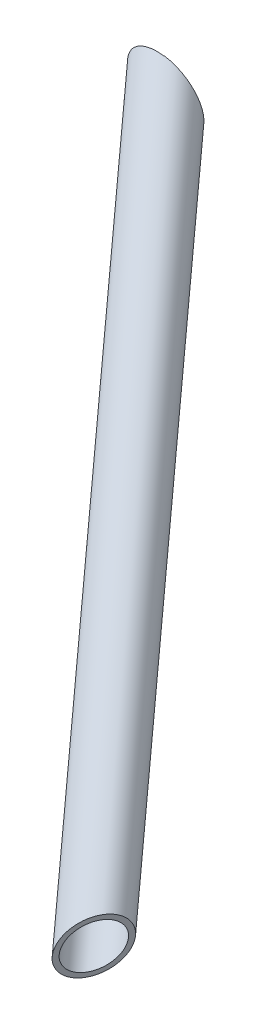
ISO-10303-21;
HEADER;
FILE_DESCRIPTION(('STEP AP214'),'2;1');
FILE_NAME('part.step','',(''),(''),'','','');
FILE_SCHEMA(('AUTOMOTIVE_DESIGN { 1 0 10303 214 1 1 1 1 }'));
ENDSEC;
DATA;
#1=APPLICATION_CONTEXT('core data for automotive mechanical design processes');
#2=APPLICATION_PROTOCOL_DEFINITION('international standard','automotive_design',2000,#1);
#3=PRODUCT_CONTEXT('',#1,'mechanical');
#4=PRODUCT('Part','Part','',(#3));
#5=PRODUCT_RELATED_PRODUCT_CATEGORY('part','',(#4));
#6=PRODUCT_DEFINITION_FORMATION('','',#4);
#7=PRODUCT_DEFINITION_CONTEXT('part definition',#1,'design');
#8=PRODUCT_DEFINITION('design','',#6,#7);
#9=PRODUCT_DEFINITION_SHAPE('','',#8);
#10=(LENGTH_UNIT() NAMED_UNIT(*) SI_UNIT(.MILLI.,.METRE.));
#11=(NAMED_UNIT(*) PLANE_ANGLE_UNIT() SI_UNIT($,.RADIAN.));
#12=(NAMED_UNIT(*) SI_UNIT($,.STERADIAN.) SOLID_ANGLE_UNIT());
#13=UNCERTAINTY_MEASURE_WITH_UNIT(LENGTH_MEASURE(1.E-05),#10,'distance_accuracy_value','');
#14=(GEOMETRIC_REPRESENTATION_CONTEXT(3) GLOBAL_UNCERTAINTY_ASSIGNED_CONTEXT((#13)) GLOBAL_UNIT_ASSIGNED_CONTEXT((#10,
#11,#12)) REPRESENTATION_CONTEXT('',''));
#15=CARTESIAN_POINT('',(0.,0.,0.));
#16=DIRECTION('',(0.,0.,1.));
#17=DIRECTION('',(1.,0.,0.));
#18=AXIS2_PLACEMENT_3D('',#15,#16,#17);
#19=CARTESIAN_POINT('',(-225.,200.,-200.));
#20=DIRECTION('',(0.636784790371592,-0.254713916148637,0.727754046138963));
#21=DIRECTION('',(0.752576694706878,0.,-0.658504607868518));
#22=AXIS2_PLACEMENT_3D('',#19,#20,#21);
#23=CYLINDRICAL_SURFACE('',#22,7.9);
#24=CARTESIAN_POINT('',(-212.607403081643,195.042961232657,-185.837032093306));
#25=DIRECTION('',(-0.936285084522112,-0.351106906695792,-0.00970466753338269));
#26=DIRECTION('',(0.181471265379071,-0.507210243684345,0.842499821093979));
#27=AXIS2_PLACEMENT_3D('',#24,#25,#26);
#28=ELLIPSE('',#27,15.3743489378713,7.9);
#29=CARTESIAN_POINT('',(-216.16230767722,204.63510274096,-189.903424238614));
#30=VERTEX_POINT('',#29);
#31=CARTESIAN_POINT('',(-216.168817710753,204.655132204404,-190.));
#32=VERTEX_POINT('',#31);
#33=EDGE_CURVE('E138',#30,#32,#28,.T.);
#34=ORIENTED_EDGE('',*,*,#33,.T.);
#35=CARTESIAN_POINT('',(-216.25,196.5,-190.));
#36=DIRECTION('',(0.,0.,-1.));
#37=DIRECTION('',(0.928476690885259,-0.371390676354104,0.));
#38=AXIS2_PLACEMENT_3D('',#35,#36,#37);
#39=ELLIPSE('',#38,10.8553158060924,7.9);
#40=CARTESIAN_POINT('',(-208.021674420814,190.,-190.));
#41=VERTEX_POINT('',#40);
#42=EDGE_CURVE('E135',#32,#41,#39,.T.);
#43=ORIENTED_EDGE('',*,*,#42,.T.);
#44=CARTESIAN_POINT('',(-200.,190.,-171.428571428571));
#45=DIRECTION('',(0.,1.,0.));
#46=DIRECTION('',(0.658504607868518,0.,0.752576694706878));
#47=AXIS2_PLACEMENT_3D('',#44,#45,#46);
#48=ELLIPSE('',#47,31.0151880174069,7.9);
#49=CARTESIAN_POINT('',(-210.653505513102,190.,-191.894594696183));
#50=VERTEX_POINT('',#49);
#51=EDGE_CURVE('E131',#41,#50,#48,.T.);
#52=ORIENTED_EDGE('',*,*,#51,.T.);
#53=CARTESIAN_POINT('',(-210.191356839065,188.712567172548,-189.903424238614));
#54=VERTEX_POINT('',#53);
#55=EDGE_CURVE('E134',#50,#54,#28,.T.);
#56=ORIENTED_EDGE('',*,*,#55,.T.);
#57=CARTESIAN_POINT('',(-216.19004498187,196.476017992748,-189.93147997928));
#58=DIRECTION('',(0.00908676337012188,0.0034075362637957,-0.999952908605234));
#59=DIRECTION('',(0.930970716300707,-0.365022539584079,0.0072160228753837));
#60=AXIS2_PLACEMENT_3D('',#57,#58,#59);
#61=ELLIPSE('',#60,10.9296964524874,7.9);
#62=CARTESIAN_POINT('',(-221.406204072577,190.278346413284,-190.));
#63=VERTEX_POINT('',#62);
#64=EDGE_CURVE('E130',#54,#63,#61,.T.);
#65=ORIENTED_EDGE('',*,*,#64,.T.);
#66=CARTESIAN_POINT('',(-216.25,196.5,-190.));
#67=DIRECTION('',(0.,0.,-1.));
#68=DIRECTION('',(0.928476690885259,-0.371390676354104,0.));
#69=AXIS2_PLACEMENT_3D('',#66,#67,#68);
#70=ELLIPSE('',#69,10.8553158060924,7.9);
#71=CARTESIAN_POINT('',(-225.692114200645,201.707440088132,-190.));
#72=VERTEX_POINT('',#71);
#73=EDGE_CURVE('E57',#63,#72,#70,.T.);
#74=ORIENTED_EDGE('',*,*,#73,.T.);
#75=EDGE_CURVE('E129',#72,#30,#61,.T.);
#76=ORIENTED_EDGE('',*,*,#75,.T.);
#77=EDGE_LOOP('',(#34,#43,#52,#56,#65,#74,#76));
#78=FACE_BOUND('',#77,.T.);
#79=CARTESIAN_POINT('',(-50.,130.,0.));
#80=DIRECTION('',(0.904650427063292,-0.140780299510551,0.402229427173004));
#81=DIRECTION('',(-0.426154437750217,-0.298851652810821,0.853861865173774));
#82=AXIS2_PLACEMENT_3D('',#79,#80,#81);
#83=ELLIPSE('',#82,8.73265491693324,7.9);
#84=CARTESIAN_POINT('',(-53.7214596461923,127.390231644648,7.4564810152916));
#85=VERTEX_POINT('',#84);
#86=EDGE_CURVE('E43',#85,#85,#83,.T.);
#87=ORIENTED_EDGE('',*,*,#86,.T.);
#88=EDGE_LOOP('',(#87));
#89=FACE_BOUND('',#88,.T.);
#90=ADVANCED_FACE('F39',(#78,#89),#23,.F.);
#91=CARTESIAN_POINT('',(-225.,200.,-200.));
#92=DIRECTION('',(0.636784790371592,-0.254713916148637,0.727754046138963));
#93=DIRECTION('',(0.752576694706878,0.,-0.658504607868518));
#94=AXIS2_PLACEMENT_3D('',#91,#92,#93);
#95=CYLINDRICAL_SURFACE('',#94,9.5);
#96=CARTESIAN_POINT('',(-216.25,196.5,-190.));
#97=DIRECTION('',(0.,0.,-1.));
#98=DIRECTION('',(0.928476690885259,-0.371390676354104,0.));
#99=AXIS2_PLACEMENT_3D('',#96,#97,#98);
#100=ELLIPSE('',#99,13.0538607794782,9.5);
#101=CARTESIAN_POINT('',(-216.828407616067,206.414038618576,-190.));
#102=VERTEX_POINT('',#101);
#103=CARTESIAN_POINT('',(-205.069430309634,190.,-190.));
#104=VERTEX_POINT('',#103);
#105=EDGE_CURVE('E127',#102,#104,#100,.T.);
#106=ORIENTED_EDGE('',*,*,#105,.F.);
#107=CARTESIAN_POINT('',(-212.607403081643,195.042961232657,-185.837032093306));
#108=DIRECTION('',(-0.936285084522112,-0.351106906695792,-0.00970466753338269));
#109=DIRECTION('',(0.181471265379071,-0.507210243684345,0.842499821093979));
#110=AXIS2_PLACEMENT_3D('',#107,#108,#109);
#111=ELLIPSE('',#110,18.4881411278199,9.5);
#112=CARTESIAN_POINT('',(-216.820628191746,206.390624113029,-189.903424238614));
#113=VERTEX_POINT('',#112);
#114=EDGE_CURVE('E152',#113,#102,#111,.T.);
#115=ORIENTED_EDGE('',*,*,#114,.F.);
#116=CARTESIAN_POINT('',(-216.19004498187,196.476017992748,-189.93147997928));
#117=DIRECTION('',(0.00908676337012188,0.0034075362637957,-0.999952908605234));
#118=DIRECTION('',(0.930970716300707,-0.365022539584079,0.0072160228753837));
#119=AXIS2_PLACEMENT_3D('',#116,#117,#118);
#120=ELLIPSE('',#119,13.1433058605861,9.5);
#121=CARTESIAN_POINT('',(-226.541890620439,203.973510540917,-190.));
#122=VERTEX_POINT('',#121);
#123=EDGE_CURVE('E146',#122,#113,#120,.T.);
#124=ORIENTED_EDGE('',*,*,#123,.F.);
#125=CARTESIAN_POINT('',(-216.25,196.5,-190.));
#126=DIRECTION('',(0.,0.,-1.));
#127=DIRECTION('',(0.928476690885259,-0.371390676354104,0.));
#128=AXIS2_PLACEMENT_3D('',#125,#126,#127);
#129=ELLIPSE('',#128,13.0538607794782,9.5);
#130=CARTESIAN_POINT('',(-223.88379908903,190.,-190.));
#131=VERTEX_POINT('',#130);
#132=EDGE_CURVE('E116',#131,#122,#129,.T.);
#133=ORIENTED_EDGE('',*,*,#132,.F.);
#134=CARTESIAN_POINT('',(-200.,190.,-171.428571428571));
#135=DIRECTION('',(0.,1.,0.));
#136=DIRECTION('',(0.658504607868518,0.,0.752576694706878));
#137=AXIS2_PLACEMENT_3D('',#134,#135,#136);
#138=ELLIPSE('',#137,37.2967450842235,9.5);
#139=CARTESIAN_POINT('',(-223.893613773629,190.,-190.023552087956));
#140=VERTEX_POINT('',#139);
#141=EDGE_CURVE('E108',#140,#131,#138,.T.);
#142=ORIENTED_EDGE('',*,*,#141,.F.);
#143=CARTESIAN_POINT('',(-209.533036324539,186.957045800479,-189.903424238614));
#144=VERTEX_POINT('',#143);
#145=EDGE_CURVE('E121',#144,#140,#120,.T.);
#146=ORIENTED_EDGE('',*,*,#145,.F.);
#147=CARTESIAN_POINT('',(-210.626522375286,190.,-194.49786877884));
#148=VERTEX_POINT('',#147);
#149=EDGE_CURVE('E149',#148,#144,#111,.T.);
#150=ORIENTED_EDGE('',*,*,#149,.F.);
#151=CARTESIAN_POINT('',(-200.,190.,-171.428571428571));
#152=DIRECTION('',(0.,1.,0.));
#153=DIRECTION('',(0.658504607868518,0.,0.752576694706878));
#154=AXIS2_PLACEMENT_3D('',#151,#152,#153);
#155=ELLIPSE('',#154,37.2967450842235,9.5);
#156=EDGE_CURVE('E126',#104,#148,#155,.T.);
#157=ORIENTED_EDGE('',*,*,#156,.F.);
#158=EDGE_LOOP('',(#106,#115,#124,#133,#142,#146,#150,#157));
#159=FACE_BOUND('',#158,.T.);
#160=CARTESIAN_POINT('',(-50.,130.,0.));
#161=DIRECTION('',(0.904650427063292,-0.140780299510551,0.402229427173004));
#162=DIRECTION('',(-0.426154437750217,-0.298851652810821,0.853861865173774));
#163=AXIS2_PLACEMENT_3D('',#160,#161,#162);
#164=ELLIPSE('',#163,10.5012938874513,9.5);
#165=CARTESIAN_POINT('',(-54.4751729922566,126.861670965083,8.96665438547722));
#166=VERTEX_POINT('',#165);
#167=EDGE_CURVE('E11',#166,#166,#164,.T.);
#168=ORIENTED_EDGE('',*,*,#167,.F.);
#169=EDGE_LOOP('',(#168));
#170=FACE_BOUND('',#169,.T.);
#171=ADVANCED_FACE('F189',(#159,#170),#95,.T.);
#172=CARTESIAN_POINT('',(-215.72801678848,203.47699370432,-189.903424238614));
#173=DIRECTION('',(0.00908676337012188,0.0034075362637957,-0.999952908605234));
#174=DIRECTION('',(-0.999958714034088,0.,-0.00908681612516445));
#175=AXIS2_PLACEMENT_3D('',#172,#173,#174);
#176=PLANE('',#175);
#177=DIRECTION('',(0.351123441588392,-0.936329177569044,0.));
#178=VECTOR('',#177,1.);
#179=CARTESIAN_POINT('',(-215.72801678848,203.47699370432,-189.903424238614));
#180=LINE('',#179,#178);
#181=EDGE_CURVE('E160',#54,#144,#180,.T.);
#182=ORIENTED_EDGE('',*,*,#181,.T.);
#183=ORIENTED_EDGE('',*,*,#145,.T.);
#184=DIRECTION('',(-0.999958714034088,0.,-0.00908681612516445));
#185=VECTOR('',#184,1.);
#186=CARTESIAN_POINT('',(-224.999694640781,190.,-190.033603256388));
#187=LINE('',#186,#185);
#188=CARTESIAN_POINT('',(-221.301824167596,190.,-190.));
#189=VERTEX_POINT('',#188);
#190=EDGE_CURVE('E106',#189,#140,#187,.T.);
#191=ORIENTED_EDGE('',*,*,#190,.F.);
#192=DIRECTION('',(0.351123441588392,-0.936329177569045,0.));
#193=VECTOR('',#192,1.);
#194=CARTESIAN_POINT('',(-221.757763653782,191.215838629832,-190.));
#195=LINE('',#194,#193);
#196=EDGE_CURVE('E112',#63,#189,#195,.T.);
#197=ORIENTED_EDGE('',*,*,#196,.F.);
#198=ORIENTED_EDGE('',*,*,#64,.F.);
#199=EDGE_LOOP('',(#182,#183,#191,#197,#198));
#200=FACE_BOUND('',#199,.T.);
#201=ADVANCED_FACE('F119',(#200),#176,.T.);
#202=EDGE_CURVE('E49',#122,#72,#195,.T.);
#203=ORIENTED_EDGE('',*,*,#202,.F.);
#204=ORIENTED_EDGE('',*,*,#123,.T.);
#205=EDGE_CURVE('E148',#113,#30,#180,.T.);
#206=ORIENTED_EDGE('',*,*,#205,.T.);
#207=ORIENTED_EDGE('',*,*,#75,.F.);
#208=EDGE_LOOP('',(#203,#204,#206,#207));
#209=FACE_BOUND('',#208,.T.);
#210=ADVANCED_FACE('F196',(#209),#176,.T.);
#211=CARTESIAN_POINT('',(-215.72801678848,203.47699370432,-189.903424238614));
#212=DIRECTION('',(-0.936285084522112,-0.351106906695792,-0.00970466753338269));
#213=DIRECTION('',(0.351123441588392,-0.936329177569045,0.));
#214=AXIS2_PLACEMENT_3D('',#211,#212,#213);
#215=PLANE('',#214);
#216=ORIENTED_EDGE('',*,*,#205,.F.);
#217=ORIENTED_EDGE('',*,*,#114,.T.);
#218=DIRECTION('',(-0.351123441588392,0.936329177569045,0.));
#219=VECTOR('',#218,1.);
#220=CARTESIAN_POINT('',(-212.439467953185,194.710199517556,-190.));
#221=LINE('',#220,#219);
#222=EDGE_CURVE('E151',#32,#102,#221,.T.);
#223=ORIENTED_EDGE('',*,*,#222,.F.);
#224=ORIENTED_EDGE('',*,*,#33,.F.);
#225=EDGE_LOOP('',(#216,#217,#223,#224));
#226=FACE_BOUND('',#225,.T.);
#227=ADVANCED_FACE('F174',(#226),#215,.T.);
#228=DIRECTION('',(-0.010364520834665,0.,0.999946286911386));
#229=VECTOR('',#228,1.);
#230=CARTESIAN_POINT('',(-210.674682172232,190.,-189.851516969429));
#231=LINE('',#230,#229);
#232=EDGE_CURVE('E145',#148,#50,#231,.T.);
#233=ORIENTED_EDGE('',*,*,#232,.F.);
#234=ORIENTED_EDGE('',*,*,#149,.T.);
#235=ORIENTED_EDGE('',*,*,#181,.F.);
#236=ORIENTED_EDGE('',*,*,#55,.F.);
#237=EDGE_LOOP('',(#233,#234,#235,#236));
#238=FACE_BOUND('',#237,.T.);
#239=ADVANCED_FACE('F203',(#238),#215,.T.);
#240=CARTESIAN_POINT('',(-225.,190.,-190.));
#241=DIRECTION('',(0.,0.,-1.));
#242=DIRECTION('',(-1.,0.,0.));
#243=AXIS2_PLACEMENT_3D('',#240,#241,#242);
#244=PLANE('',#243);
#245=ORIENTED_EDGE('',*,*,#222,.T.);
#246=ORIENTED_EDGE('',*,*,#105,.T.);
#247=DIRECTION('',(1.,0.,0.));
#248=VECTOR('',#247,1.);
#249=CARTESIAN_POINT('',(-225.,190.,-190.));
#250=LINE('',#249,#248);
#251=EDGE_CURVE('E111',#41,#104,#250,.T.);
#252=ORIENTED_EDGE('',*,*,#251,.F.);
#253=ORIENTED_EDGE('',*,*,#42,.F.);
#254=EDGE_LOOP('',(#245,#246,#252,#253));
#255=FACE_BOUND('',#254,.T.);
#256=ADVANCED_FACE('F171',(#255),#244,.T.);
#257=CARTESIAN_POINT('',(-225.,190.,-190.));
#258=DIRECTION('',(0.,1.,0.));
#259=DIRECTION('',(0.,0.,1.));
#260=AXIS2_PLACEMENT_3D('',#257,#258,#259);
#261=PLANE('',#260);
#262=ORIENTED_EDGE('',*,*,#251,.T.);
#263=ORIENTED_EDGE('',*,*,#156,.T.);
#264=ORIENTED_EDGE('',*,*,#232,.T.);
#265=ORIENTED_EDGE('',*,*,#51,.F.);
#266=EDGE_LOOP('',(#262,#263,#264,#265));
#267=FACE_BOUND('',#266,.T.);
#268=ADVANCED_FACE('F164',(#267),#261,.T.);
#269=ORIENTED_EDGE('',*,*,#141,.T.);
#270=EDGE_CURVE('E100',#131,#189,#250,.T.);
#271=ORIENTED_EDGE('',*,*,#270,.T.);
#272=ORIENTED_EDGE('',*,*,#190,.T.);
#273=EDGE_LOOP('',(#269,#271,#272));
#274=FACE_BOUND('',#273,.T.);
#275=ADVANCED_FACE('F104',(#274),#261,.T.);
#276=ORIENTED_EDGE('',*,*,#196,.T.);
#277=ORIENTED_EDGE('',*,*,#270,.F.);
#278=ORIENTED_EDGE('',*,*,#132,.T.);
#279=ORIENTED_EDGE('',*,*,#202,.T.);
#280=ORIENTED_EDGE('',*,*,#73,.F.);
#281=EDGE_LOOP('',(#276,#277,#278,#279,#280));
#282=FACE_BOUND('',#281,.T.);
#283=ADVANCED_FACE('F113',(#282),#244,.T.);
#284=CARTESIAN_POINT('',(-50.,130.,0.));
#285=DIRECTION('',(0.904650427063292,-0.140780299510551,0.402229427173004));
#286=DIRECTION('',(0.406275581998161,0.,-0.913750595880547));
#287=AXIS2_PLACEMENT_3D('',#284,#285,#286);
#288=PLANE('',#287);
#289=ORIENTED_EDGE('',*,*,#86,.F.);
#290=EDGE_LOOP('',(#289));
#291=FACE_BOUND('',#290,.T.);
#292=ORIENTED_EDGE('',*,*,#167,.T.);
#293=EDGE_LOOP('',(#292));
#294=FACE_BOUND('',#293,.T.);
#295=ADVANCED_FACE('F41',(#291,#294),#288,.T.);
#296=CLOSED_SHELL('',(#90,#171,#201,#210,#227,#239,#256,#268,#275,#283,#295));
#297=MANIFOLD_SOLID_BREP('B2',#296);
#298=ADVANCED_BREP_SHAPE_REPRESENTATION('',(#18,#297),#14);
#299=SHAPE_DEFINITION_REPRESENTATION(#9,#298);
ENDSEC;
END-ISO-10303-21;
